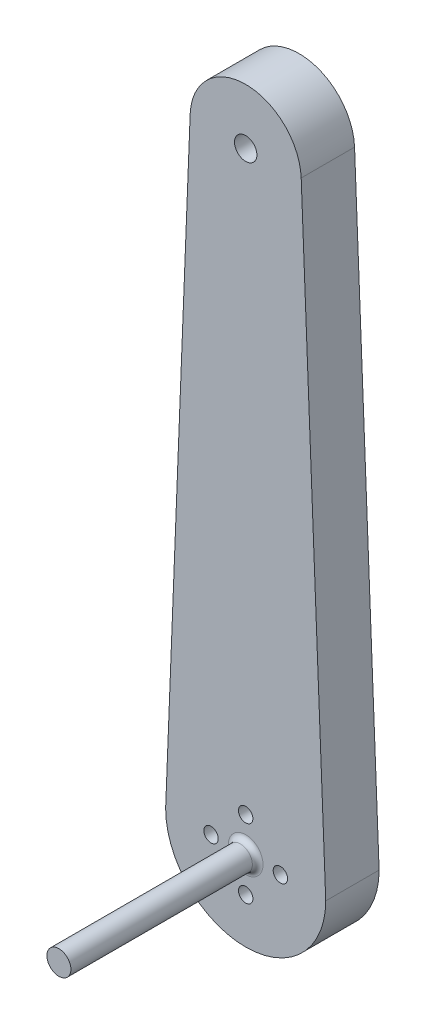
ISO-10303-21;
HEADER;
FILE_DESCRIPTION(('STEP AP214'),'2;1');
FILE_NAME('part.step','',(''),(''),'','','');
FILE_SCHEMA(('AUTOMOTIVE_DESIGN { 1 0 10303 214 1 1 1 1 }'));
ENDSEC;
DATA;
#1=APPLICATION_CONTEXT('core data for automotive mechanical design processes');
#2=APPLICATION_PROTOCOL_DEFINITION('international standard','automotive_design',2000,#1);
#3=PRODUCT_CONTEXT('',#1,'mechanical');
#4=PRODUCT('Part','Part','',(#3));
#5=PRODUCT_RELATED_PRODUCT_CATEGORY('part','',(#4));
#6=PRODUCT_DEFINITION_FORMATION('','',#4);
#7=PRODUCT_DEFINITION_CONTEXT('part definition',#1,'design');
#8=PRODUCT_DEFINITION('design','',#6,#7);
#9=PRODUCT_DEFINITION_SHAPE('','',#8);
#10=(LENGTH_UNIT() NAMED_UNIT(*) SI_UNIT(.MILLI.,.METRE.));
#11=(NAMED_UNIT(*) PLANE_ANGLE_UNIT() SI_UNIT($,.RADIAN.));
#12=(NAMED_UNIT(*) SI_UNIT($,.STERADIAN.) SOLID_ANGLE_UNIT());
#13=UNCERTAINTY_MEASURE_WITH_UNIT(LENGTH_MEASURE(1.E-05),#10,'distance_accuracy_value','');
#14=(GEOMETRIC_REPRESENTATION_CONTEXT(3) GLOBAL_UNCERTAINTY_ASSIGNED_CONTEXT((#13)) GLOBAL_UNIT_ASSIGNED_CONTEXT((#10,
#11,#12)) REPRESENTATION_CONTEXT('',''));
#15=CARTESIAN_POINT('',(0.,0.,0.));
#16=DIRECTION('',(0.,0.,1.));
#17=DIRECTION('',(1.,0.,0.));
#18=AXIS2_PLACEMENT_3D('',#15,#16,#17);
#19=CARTESIAN_POINT('',(15.,129.592003197443,10.));
#20=DIRECTION('',(0.,0.,1.));
#21=DIRECTION('',(1.,0.,0.));
#22=AXIS2_PLACEMENT_3D('',#19,#20,#21);
#23=CYLINDRICAL_SURFACE('',#22,10.4079968025575);
#24=DIRECTION('',(0.,0.,1.));
#25=VECTOR('',#24,1.);
#26=CARTESIAN_POINT('',(4.60031961651128,130.007990412782,0.));
#27=LINE('',#26,#25);
#28=CARTESIAN_POINT('',(4.60031961651128,130.007990412782,10.));
#29=VERTEX_POINT('',#28);
#30=CARTESIAN_POINT('',(4.60031961651128,130.007990412782,0.));
#31=VERTEX_POINT('',#30);
#32=EDGE_CURVE('E93',#29,#31,#27,.F.);
#33=ORIENTED_EDGE('',*,*,#32,.F.);
#34=CARTESIAN_POINT('',(15.,129.592003197443,10.));
#35=DIRECTION('',(0.,0.,-1.));
#36=DIRECTION('',(-1.,0.,0.));
#37=AXIS2_PLACEMENT_3D('',#34,#35,#36);
#38=CIRCLE('',#37,10.4079968025575);
#39=CARTESIAN_POINT('',(25.3996803834887,130.007990412782,10.));
#40=VERTEX_POINT('',#39);
#41=EDGE_CURVE('E68',#40,#29,#38,.F.);
#42=ORIENTED_EDGE('',*,*,#41,.F.);
#43=DIRECTION('',(0.,0.,1.));
#44=VECTOR('',#43,1.);
#45=CARTESIAN_POINT('',(25.3996803834887,130.007990412782,0.));
#46=LINE('',#45,#44);
#47=CARTESIAN_POINT('',(25.3996803834887,130.007990412782,0.));
#48=VERTEX_POINT('',#47);
#49=EDGE_CURVE('E118',#48,#40,#46,.T.);
#50=ORIENTED_EDGE('',*,*,#49,.F.);
#51=CARTESIAN_POINT('',(15.,129.592003197443,0.));
#52=DIRECTION('',(0.,0.,-1.));
#53=DIRECTION('',(-1.,0.,0.));
#54=AXIS2_PLACEMENT_3D('',#51,#52,#53);
#55=CIRCLE('',#54,10.4079968025575);
#56=EDGE_CURVE('E61',#31,#48,#55,.T.);
#57=ORIENTED_EDGE('',*,*,#56,.F.);
#58=EDGE_LOOP('',(#33,#42,#50,#57));
#59=FACE_BOUND('',#58,.T.);
#60=ADVANCED_FACE('F46',(#59),#23,.T.);
#61=CARTESIAN_POINT('',(15.,15.,0.));
#62=DIRECTION('',(0.,0.,-1.));
#63=DIRECTION('',(-1.,0.,0.));
#64=AXIS2_PLACEMENT_3D('',#61,#62,#63);
#65=CYLINDRICAL_SURFACE('',#64,15.);
#66=DIRECTION('',(0.,0.,-1.));
#67=VECTOR('',#66,1.);
#68=CARTESIAN_POINT('',(0.,15.,10.));
#69=LINE('',#68,#67);
#70=CARTESIAN_POINT('',(0.,15.,0.));
#71=VERTEX_POINT('',#70);
#72=CARTESIAN_POINT('',(0.,15.,10.));
#73=VERTEX_POINT('',#72);
#74=EDGE_CURVE('E91',#71,#73,#69,.F.);
#75=ORIENTED_EDGE('',*,*,#74,.F.);
#76=CARTESIAN_POINT('',(15.,15.,0.));
#77=DIRECTION('',(0.,0.,-1.));
#78=DIRECTION('',(-1.,0.,0.));
#79=AXIS2_PLACEMENT_3D('',#76,#77,#78);
#80=CIRCLE('',#79,15.);
#81=CARTESIAN_POINT('',(30.,15.,0.));
#82=VERTEX_POINT('',#81);
#83=EDGE_CURVE('E97',#82,#71,#80,.T.);
#84=ORIENTED_EDGE('',*,*,#83,.F.);
#85=DIRECTION('',(0.,0.,-1.));
#86=VECTOR('',#85,1.);
#87=CARTESIAN_POINT('',(30.,15.,10.));
#88=LINE('',#87,#86);
#89=CARTESIAN_POINT('',(30.,15.,10.));
#90=VERTEX_POINT('',#89);
#91=EDGE_CURVE('E105',#90,#82,#88,.T.);
#92=ORIENTED_EDGE('',*,*,#91,.F.);
#93=CARTESIAN_POINT('',(15.,15.,10.));
#94=DIRECTION('',(0.,0.,-1.));
#95=DIRECTION('',(-1.,0.,0.));
#96=AXIS2_PLACEMENT_3D('',#93,#94,#95);
#97=CIRCLE('',#96,15.);
#98=EDGE_CURVE('E104',#73,#90,#97,.F.);
#99=ORIENTED_EDGE('',*,*,#98,.F.);
#100=EDGE_LOOP('',(#75,#84,#92,#99));
#101=FACE_BOUND('',#100,.T.);
#102=ADVANCED_FACE('F108',(#101),#65,.T.);
#103=CARTESIAN_POINT('',(0.,0.,10.));
#104=DIRECTION('',(0.,0.,-1.));
#105=DIRECTION('',(-1.,0.,0.));
#106=AXIS2_PLACEMENT_3D('',#103,#104,#105);
#107=PLANE('',#106);
#108=CARTESIAN_POINT('',(15.,15.,10.));
#109=DIRECTION('',(0.,0.,-1.));
#110=DIRECTION('',(-1.,0.,0.));
#111=AXIS2_PLACEMENT_3D('',#108,#109,#110);
#112=CIRCLE('',#111,3.25);
#113=CARTESIAN_POINT('',(11.75,15.,10.));
#114=VERTEX_POINT('',#113);
#115=EDGE_CURVE('E12',#114,#114,#112,.T.);
#116=ORIENTED_EDGE('',*,*,#115,.T.);
#117=EDGE_LOOP('',(#116));
#118=FACE_BOUND('',#117,.T.);
#119=CARTESIAN_POINT('',(15.,8.50000000000001,10.));
#120=DIRECTION('',(0.,0.,1.));
#121=DIRECTION('',(1.,0.,0.));
#122=AXIS2_PLACEMENT_3D('',#119,#120,#121);
#123=CIRCLE('',#122,1.35);
#124=CARTESIAN_POINT('',(16.35,8.50000000000001,10.));
#125=VERTEX_POINT('',#124);
#126=EDGE_CURVE('E240',#125,#125,#123,.T.);
#127=ORIENTED_EDGE('',*,*,#126,.F.);
#128=EDGE_LOOP('',(#127));
#129=FACE_BOUND('',#128,.T.);
#130=CARTESIAN_POINT('',(21.5,15.,10.));
#131=DIRECTION('',(0.,0.,1.));
#132=DIRECTION('',(1.,0.,0.));
#133=AXIS2_PLACEMENT_3D('',#130,#131,#132);
#134=CIRCLE('',#133,1.35);
#135=CARTESIAN_POINT('',(22.85,15.,10.));
#136=VERTEX_POINT('',#135);
#137=EDGE_CURVE('E247',#136,#136,#134,.T.);
#138=ORIENTED_EDGE('',*,*,#137,.F.);
#139=EDGE_LOOP('',(#138));
#140=FACE_BOUND('',#139,.T.);
#141=CARTESIAN_POINT('',(15.,21.5,10.));
#142=DIRECTION('',(0.,0.,1.));
#143=DIRECTION('',(1.,0.,0.));
#144=AXIS2_PLACEMENT_3D('',#141,#142,#143);
#145=CIRCLE('',#144,1.35);
#146=CARTESIAN_POINT('',(16.35,21.5,10.));
#147=VERTEX_POINT('',#146);
#148=EDGE_CURVE('E256',#147,#147,#145,.T.);
#149=ORIENTED_EDGE('',*,*,#148,.F.);
#150=EDGE_LOOP('',(#149));
#151=FACE_BOUND('',#150,.T.);
#152=CARTESIAN_POINT('',(8.5,15.,10.));
#153=DIRECTION('',(0.,0.,1.));
#154=DIRECTION('',(1.,0.,0.));
#155=AXIS2_PLACEMENT_3D('',#152,#153,#154);
#156=CIRCLE('',#155,1.35);
#157=CARTESIAN_POINT('',(9.85,15.,10.));
#158=VERTEX_POINT('',#157);
#159=EDGE_CURVE('E262',#158,#158,#156,.T.);
#160=ORIENTED_EDGE('',*,*,#159,.F.);
#161=EDGE_LOOP('',(#160));
#162=FACE_BOUND('',#161,.T.);
#163=CARTESIAN_POINT('',(15.,129.592003197443,10.));
#164=DIRECTION('',(0.,0.,1.));
#165=DIRECTION('',(1.,0.,0.));
#166=AXIS2_PLACEMENT_3D('',#163,#164,#165);
#167=CIRCLE('',#166,2.1);
#168=CARTESIAN_POINT('',(17.1,129.592003197443,10.));
#169=VERTEX_POINT('',#168);
#170=EDGE_CURVE('E244',#169,#169,#167,.T.);
#171=ORIENTED_EDGE('',*,*,#170,.F.);
#172=EDGE_LOOP('',(#171));
#173=FACE_BOUND('',#172,.T.);
#174=DIRECTION('',(0.0399680383488716,-0.999200958721789,0.));
#175=VECTOR('',#174,1.);
#176=CARTESIAN_POINT('',(30.,15.,10.));
#177=LINE('',#176,#175);
#178=EDGE_CURVE('E113',#40,#90,#177,.T.);
#179=ORIENTED_EDGE('',*,*,#178,.F.);
#180=ORIENTED_EDGE('',*,*,#41,.T.);
#181=DIRECTION('',(0.0399680383488716,0.999200958721789,0.));
#182=VECTOR('',#181,1.);
#183=CARTESIAN_POINT('',(0.,15.,10.));
#184=LINE('',#183,#182);
#185=EDGE_CURVE('E94',#73,#29,#184,.T.);
#186=ORIENTED_EDGE('',*,*,#185,.F.);
#187=ORIENTED_EDGE('',*,*,#98,.T.);
#188=EDGE_LOOP('',(#179,#180,#186,#187));
#189=FACE_BOUND('',#188,.T.);
#190=ADVANCED_FACE('F142',(#118,#129,#140,#151,#162,#173,#189),#107,.F.);
#191=CARTESIAN_POINT('',(0.,0.,0.));
#192=DIRECTION('',(0.,0.,-1.));
#193=DIRECTION('',(-1.,0.,0.));
#194=AXIS2_PLACEMENT_3D('',#191,#192,#193);
#195=PLANE('',#194);
#196=CARTESIAN_POINT('',(15.,8.50000000000001,0.));
#197=DIRECTION('',(0.,0.,1.));
#198=DIRECTION('',(1.,0.,0.));
#199=AXIS2_PLACEMENT_3D('',#196,#197,#198);
#200=CIRCLE('',#199,1.35);
#201=CARTESIAN_POINT('',(16.35,8.50000000000001,0.));
#202=VERTEX_POINT('',#201);
#203=EDGE_CURVE('E237',#202,#202,#200,.T.);
#204=ORIENTED_EDGE('',*,*,#203,.T.);
#205=EDGE_LOOP('',(#204));
#206=FACE_BOUND('',#205,.T.);
#207=CARTESIAN_POINT('',(21.5,15.,0.));
#208=DIRECTION('',(0.,0.,1.));
#209=DIRECTION('',(1.,0.,0.));
#210=AXIS2_PLACEMENT_3D('',#207,#208,#209);
#211=CIRCLE('',#210,1.35);
#212=CARTESIAN_POINT('',(22.85,15.,0.));
#213=VERTEX_POINT('',#212);
#214=EDGE_CURVE('E242',#213,#213,#211,.T.);
#215=ORIENTED_EDGE('',*,*,#214,.T.);
#216=EDGE_LOOP('',(#215));
#217=FACE_BOUND('',#216,.T.);
#218=CARTESIAN_POINT('',(15.,21.5,0.));
#219=DIRECTION('',(0.,0.,1.));
#220=DIRECTION('',(1.,0.,0.));
#221=AXIS2_PLACEMENT_3D('',#218,#219,#220);
#222=CIRCLE('',#221,1.35);
#223=CARTESIAN_POINT('',(16.35,21.5,0.));
#224=VERTEX_POINT('',#223);
#225=EDGE_CURVE('E253',#224,#224,#222,.T.);
#226=ORIENTED_EDGE('',*,*,#225,.T.);
#227=EDGE_LOOP('',(#226));
#228=FACE_BOUND('',#227,.T.);
#229=CARTESIAN_POINT('',(8.5,15.,0.));
#230=DIRECTION('',(0.,0.,1.));
#231=DIRECTION('',(1.,0.,0.));
#232=AXIS2_PLACEMENT_3D('',#229,#230,#231);
#233=CIRCLE('',#232,1.35);
#234=CARTESIAN_POINT('',(9.85,15.,0.));
#235=VERTEX_POINT('',#234);
#236=EDGE_CURVE('E259',#235,#235,#233,.T.);
#237=ORIENTED_EDGE('',*,*,#236,.T.);
#238=EDGE_LOOP('',(#237));
#239=FACE_BOUND('',#238,.T.);
#240=CARTESIAN_POINT('',(15.,129.592003197443,0.));
#241=DIRECTION('',(0.,0.,1.));
#242=DIRECTION('',(1.,0.,0.));
#243=AXIS2_PLACEMENT_3D('',#240,#241,#242);
#244=CIRCLE('',#243,2.1);
#245=CARTESIAN_POINT('',(17.1,129.592003197443,0.));
#246=VERTEX_POINT('',#245);
#247=EDGE_CURVE('E266',#246,#246,#244,.T.);
#248=ORIENTED_EDGE('',*,*,#247,.T.);
#249=EDGE_LOOP('',(#248));
#250=FACE_BOUND('',#249,.T.);
#251=DIRECTION('',(0.0399680383488716,0.999200958721789,0.));
#252=VECTOR('',#251,1.);
#253=CARTESIAN_POINT('',(0.,15.,0.));
#254=LINE('',#253,#252);
#255=EDGE_CURVE('E86',#71,#31,#254,.T.);
#256=ORIENTED_EDGE('',*,*,#255,.T.);
#257=ORIENTED_EDGE('',*,*,#56,.T.);
#258=DIRECTION('',(0.0399680383488716,-0.999200958721789,0.));
#259=VECTOR('',#258,1.);
#260=CARTESIAN_POINT('',(30.,15.,0.));
#261=LINE('',#260,#259);
#262=EDGE_CURVE('E100',#48,#82,#261,.T.);
#263=ORIENTED_EDGE('',*,*,#262,.T.);
#264=ORIENTED_EDGE('',*,*,#83,.T.);
#265=EDGE_LOOP('',(#256,#257,#263,#264));
#266=FACE_BOUND('',#265,.T.);
#267=ADVANCED_FACE('F98',(#206,#217,#228,#239,#250,#266),#195,.T.);
#268=CARTESIAN_POINT('',(30.,15.,0.));
#269=DIRECTION('',(-0.999200958721789,-0.0399680383488716,0.));
#270=DIRECTION('',(0.0399680383488716,-0.99920095872179,0.));
#271=AXIS2_PLACEMENT_3D('',#268,#269,#270);
#272=PLANE('',#271);
#273=ORIENTED_EDGE('',*,*,#262,.F.);
#274=ORIENTED_EDGE('',*,*,#49,.T.);
#275=ORIENTED_EDGE('',*,*,#178,.T.);
#276=ORIENTED_EDGE('',*,*,#91,.T.);
#277=EDGE_LOOP('',(#273,#274,#275,#276));
#278=FACE_BOUND('',#277,.T.);
#279=ADVANCED_FACE('F153',(#278),#272,.F.);
#280=CARTESIAN_POINT('',(0.,15.,0.));
#281=DIRECTION('',(0.999200958721789,-0.0399680383488716,0.));
#282=DIRECTION('',(0.0399680383488716,0.99920095872179,0.));
#283=AXIS2_PLACEMENT_3D('',#280,#281,#282);
#284=PLANE('',#283);
#285=ORIENTED_EDGE('',*,*,#185,.T.);
#286=ORIENTED_EDGE('',*,*,#32,.T.);
#287=ORIENTED_EDGE('',*,*,#255,.F.);
#288=ORIENTED_EDGE('',*,*,#74,.T.);
#289=EDGE_LOOP('',(#285,#286,#287,#288));
#290=FACE_BOUND('',#289,.T.);
#291=ADVANCED_FACE('F89',(#290),#284,.F.);
#292=CARTESIAN_POINT('',(15.,129.592003197443,0.));
#293=DIRECTION('',(0.,0.,1.));
#294=DIRECTION('',(1.,0.,0.));
#295=AXIS2_PLACEMENT_3D('',#292,#293,#294);
#296=CYLINDRICAL_SURFACE('',#295,2.1);
#297=ORIENTED_EDGE('',*,*,#247,.F.);
#298=EDGE_LOOP('',(#297));
#299=FACE_BOUND('',#298,.T.);
#300=ORIENTED_EDGE('',*,*,#170,.T.);
#301=EDGE_LOOP('',(#300));
#302=FACE_BOUND('',#301,.T.);
#303=ADVANCED_FACE('F162',(#299,#302),#296,.F.);
#304=CARTESIAN_POINT('',(8.5,15.,0.));
#305=DIRECTION('',(0.,0.,1.));
#306=DIRECTION('',(1.,0.,0.));
#307=AXIS2_PLACEMENT_3D('',#304,#305,#306);
#308=CYLINDRICAL_SURFACE('',#307,1.35);
#309=ORIENTED_EDGE('',*,*,#236,.F.);
#310=EDGE_LOOP('',(#309));
#311=FACE_BOUND('',#310,.T.);
#312=ORIENTED_EDGE('',*,*,#159,.T.);
#313=EDGE_LOOP('',(#312));
#314=FACE_BOUND('',#313,.T.);
#315=ADVANCED_FACE('F165',(#311,#314),#308,.F.);
#316=CARTESIAN_POINT('',(15.,21.5,0.));
#317=DIRECTION('',(0.,0.,1.));
#318=DIRECTION('',(1.,0.,0.));
#319=AXIS2_PLACEMENT_3D('',#316,#317,#318);
#320=CYLINDRICAL_SURFACE('',#319,1.35);
#321=ORIENTED_EDGE('',*,*,#225,.F.);
#322=EDGE_LOOP('',(#321));
#323=FACE_BOUND('',#322,.T.);
#324=ORIENTED_EDGE('',*,*,#148,.T.);
#325=EDGE_LOOP('',(#324));
#326=FACE_BOUND('',#325,.T.);
#327=ADVANCED_FACE('F169',(#323,#326),#320,.F.);
#328=CARTESIAN_POINT('',(21.5,15.,0.));
#329=DIRECTION('',(0.,0.,1.));
#330=DIRECTION('',(1.,0.,0.));
#331=AXIS2_PLACEMENT_3D('',#328,#329,#330);
#332=CYLINDRICAL_SURFACE('',#331,1.35);
#333=ORIENTED_EDGE('',*,*,#214,.F.);
#334=EDGE_LOOP('',(#333));
#335=FACE_BOUND('',#334,.T.);
#336=ORIENTED_EDGE('',*,*,#137,.T.);
#337=EDGE_LOOP('',(#336));
#338=FACE_BOUND('',#337,.T.);
#339=ADVANCED_FACE('F173',(#335,#338),#332,.F.);
#340=CARTESIAN_POINT('',(15.,8.50000000000001,0.));
#341=DIRECTION('',(0.,0.,1.));
#342=DIRECTION('',(1.,0.,0.));
#343=AXIS2_PLACEMENT_3D('',#340,#341,#342);
#344=CYLINDRICAL_SURFACE('',#343,1.35);
#345=ORIENTED_EDGE('',*,*,#203,.F.);
#346=EDGE_LOOP('',(#345));
#347=FACE_BOUND('',#346,.T.);
#348=ORIENTED_EDGE('',*,*,#126,.T.);
#349=EDGE_LOOP('',(#348));
#350=FACE_BOUND('',#349,.T.);
#351=ADVANCED_FACE('F177',(#347,#350),#344,.F.);
#352=CARTESIAN_POINT('',(15.,15.,45.));
#353=DIRECTION('',(0.,0.,-1.));
#354=DIRECTION('',(-1.,0.,0.));
#355=AXIS2_PLACEMENT_3D('',#352,#353,#354);
#356=CYLINDRICAL_SURFACE('',#355,2.25);
#357=CARTESIAN_POINT('',(15.,15.,11.));
#358=DIRECTION('',(0.,0.,-1.));
#359=DIRECTION('',(-1.,0.,0.));
#360=AXIS2_PLACEMENT_3D('',#357,#358,#359);
#361=CIRCLE('',#360,2.25);
#362=CARTESIAN_POINT('',(12.75,15.,11.));
#363=VERTEX_POINT('',#362);
#364=EDGE_CURVE('E54',#363,#363,#361,.F.);
#365=ORIENTED_EDGE('',*,*,#364,.T.);
#366=EDGE_LOOP('',(#365));
#367=FACE_BOUND('',#366,.T.);
#368=CARTESIAN_POINT('',(15.,15.,45.));
#369=DIRECTION('',(0.,0.,1.));
#370=DIRECTION('',(1.,0.,0.));
#371=AXIS2_PLACEMENT_3D('',#368,#369,#370);
#372=CIRCLE('',#371,2.25);
#373=CARTESIAN_POINT('',(17.25,15.,45.));
#374=VERTEX_POINT('',#373);
#375=EDGE_CURVE('E265',#374,#374,#372,.T.);
#376=ORIENTED_EDGE('',*,*,#375,.F.);
#377=EDGE_LOOP('',(#376));
#378=FACE_BOUND('',#377,.T.);
#379=ADVANCED_FACE('F124',(#367,#378),#356,.T.);
#380=CARTESIAN_POINT('',(15.,15.,45.));
#381=DIRECTION('',(0.,0.,1.));
#382=DIRECTION('',(1.,0.,0.));
#383=AXIS2_PLACEMENT_3D('',#380,#381,#382);
#384=PLANE('',#383);
#385=ORIENTED_EDGE('',*,*,#375,.T.);
#386=EDGE_LOOP('',(#385));
#387=FACE_BOUND('',#386,.T.);
#388=ADVANCED_FACE('F128',(#387),#384,.T.);
#389=CARTESIAN_POINT('',(15.,15.,11.));
#390=DIRECTION('',(0.,0.,-1.));
#391=DIRECTION('',(-1.,0.,0.));
#392=AXIS2_PLACEMENT_3D('',#389,#390,#391);
#393=TOROIDAL_SURFACE('',#392,3.25,1.);
#394=ORIENTED_EDGE('',*,*,#115,.F.);
#395=EDGE_LOOP('',(#394));
#396=FACE_BOUND('',#395,.T.);
#397=ORIENTED_EDGE('',*,*,#364,.F.);
#398=EDGE_LOOP('',(#397));
#399=FACE_BOUND('',#398,.T.);
#400=ADVANCED_FACE('F48',(#396,#399),#393,.F.);
#401=CLOSED_SHELL('',(#60,#102,#190,#267,#279,#291,#303,#315,#327,#339,#351,#379,#388,#400));
#402=MANIFOLD_SOLID_BREP('B2',#401);
#403=ADVANCED_BREP_SHAPE_REPRESENTATION('',(#18,#402),#14);
#404=SHAPE_DEFINITION_REPRESENTATION(#9,#403);
ENDSEC;
END-ISO-10303-21;
